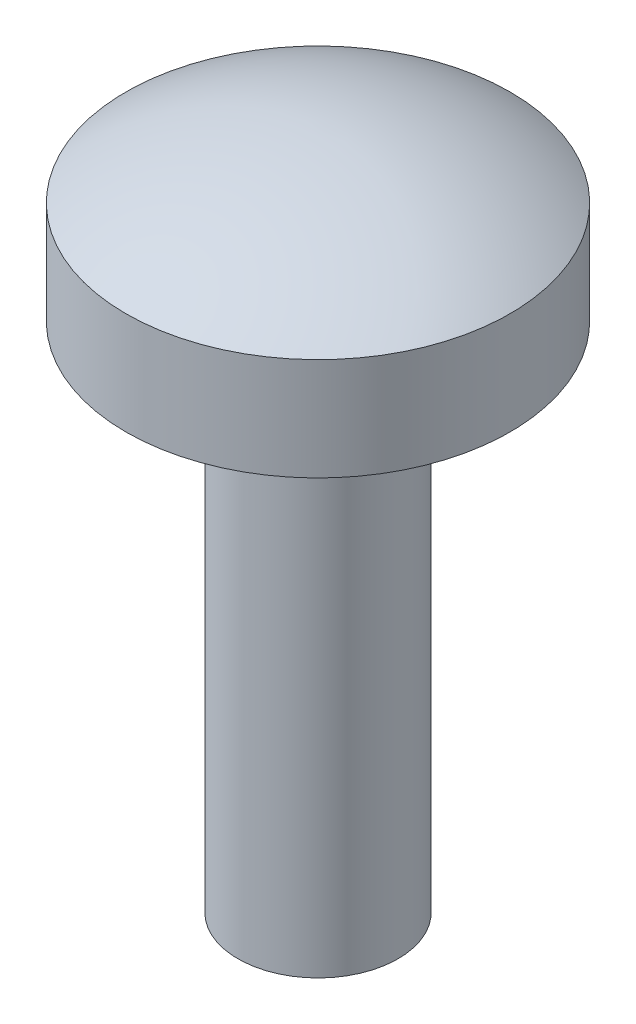
ISO-10303-21;
HEADER;
FILE_DESCRIPTION(('STEP AP214'),'2;1');
FILE_NAME('part.step','',(''),(''),'','','');
FILE_SCHEMA(('AUTOMOTIVE_DESIGN { 1 0 10303 214 1 1 1 1 }'));
ENDSEC;
DATA;
#1=APPLICATION_CONTEXT('core data for automotive mechanical design processes');
#2=APPLICATION_PROTOCOL_DEFINITION('international standard','automotive_design',2000,#1);
#3=PRODUCT_CONTEXT('',#1,'mechanical');
#4=PRODUCT('Part','Part','',(#3));
#5=PRODUCT_RELATED_PRODUCT_CATEGORY('part','',(#4));
#6=PRODUCT_DEFINITION_FORMATION('','',#4);
#7=PRODUCT_DEFINITION_CONTEXT('part definition',#1,'design');
#8=PRODUCT_DEFINITION('design','',#6,#7);
#9=PRODUCT_DEFINITION_SHAPE('','',#8);
#10=(LENGTH_UNIT() NAMED_UNIT(*) SI_UNIT(.MILLI.,.METRE.));
#11=(NAMED_UNIT(*) PLANE_ANGLE_UNIT() SI_UNIT($,.RADIAN.));
#12=(NAMED_UNIT(*) SI_UNIT($,.STERADIAN.) SOLID_ANGLE_UNIT());
#13=UNCERTAINTY_MEASURE_WITH_UNIT(LENGTH_MEASURE(1.E-05),#10,'distance_accuracy_value','');
#14=(GEOMETRIC_REPRESENTATION_CONTEXT(3) GLOBAL_UNCERTAINTY_ASSIGNED_CONTEXT((#13)) GLOBAL_UNIT_ASSIGNED_CONTEXT((#10,
#11,#12)) REPRESENTATION_CONTEXT('',''));
#15=CARTESIAN_POINT('',(0.,0.,0.));
#16=DIRECTION('',(0.,0.,1.));
#17=DIRECTION('',(1.,0.,0.));
#18=AXIS2_PLACEMENT_3D('',#15,#16,#17);
#19=CARTESIAN_POINT('',(0.,0.,0.));
#20=DIRECTION('',(0.,1.,0.));
#21=DIRECTION('',(0.,0.,1.));
#22=AXIS2_PLACEMENT_3D('',#19,#20,#21);
#23=PLANE('',#22);
#24=CARTESIAN_POINT('',(0.,0.,0.));
#25=DIRECTION('',(0.,-1.,0.));
#26=DIRECTION('',(0.,0.,-1.));
#27=AXIS2_PLACEMENT_3D('',#24,#25,#26);
#28=CIRCLE('',#27,1.25);
#29=CARTESIAN_POINT('',(0.,0.,-1.25));
#30=VERTEX_POINT('',#29);
#31=EDGE_CURVE('E10',#30,#30,#28,.T.);
#32=ORIENTED_EDGE('',*,*,#31,.F.);
#33=EDGE_LOOP('',(#32));
#34=FACE_BOUND('',#33,.T.);
#35=CARTESIAN_POINT('',(0.,0.,0.));
#36=DIRECTION('',(0.,1.,0.));
#37=DIRECTION('',(0.,0.,1.));
#38=AXIS2_PLACEMENT_3D('',#35,#36,#37);
#39=CIRCLE('',#38,3.);
#40=CARTESIAN_POINT('',(0.,0.,3.));
#41=VERTEX_POINT('',#40);
#42=EDGE_CURVE('E33',#41,#41,#39,.T.);
#43=ORIENTED_EDGE('',*,*,#42,.F.);
#44=EDGE_LOOP('',(#43));
#45=FACE_BOUND('',#44,.T.);
#46=ADVANCED_FACE('F30',(#34,#45),#23,.F.);
#47=CARTESIAN_POINT('',(0.,2.52,0.));
#48=DIRECTION('',(0.,1.,0.));
#49=DIRECTION('',(0.,0.,1.));
#50=AXIS2_PLACEMENT_3D('',#47,#48,#49);
#51=CYLINDRICAL_SURFACE('',#50,3.);
#52=CARTESIAN_POINT('',(0.,1.6,0.));
#53=DIRECTION('',(0.,1.,0.));
#54=DIRECTION('',(0.,0.,1.));
#55=AXIS2_PLACEMENT_3D('',#52,#53,#54);
#56=CIRCLE('',#55,3.);
#57=CARTESIAN_POINT('',(0.,1.6,3.));
#58=VERTEX_POINT('',#57);
#59=EDGE_CURVE('E41',#58,#58,#56,.T.);
#60=ORIENTED_EDGE('',*,*,#59,.F.);
#61=EDGE_LOOP('',(#60));
#62=FACE_BOUND('',#61,.T.);
#63=ORIENTED_EDGE('',*,*,#42,.T.);
#64=EDGE_LOOP('',(#63));
#65=FACE_BOUND('',#64,.T.);
#66=ADVANCED_FACE('F61',(#62,#65),#51,.T.);
#67=CARTESIAN_POINT('',(0.,-2.83130434782609,0.));
#68=DIRECTION('',(0.,1.,0.));
#69=DIRECTION('',(0.,0.,-1.));
#70=AXIS2_PLACEMENT_3D('',#67,#68,#69);
#71=SPHERICAL_SURFACE('',#70,5.35130434782609);
#72=ORIENTED_EDGE('',*,*,#59,.T.);
#73=EDGE_LOOP('',(#72));
#74=FACE_BOUND('',#73,.T.);
#75=ADVANCED_FACE('F54',(#74),#71,.T.);
#76=CARTESIAN_POINT('',(0.,-8.,0.));
#77=DIRECTION('',(0.,1.,0.));
#78=DIRECTION('',(0.,0.,1.));
#79=AXIS2_PLACEMENT_3D('',#76,#77,#78);
#80=CYLINDRICAL_SURFACE('',#79,1.25);
#81=CARTESIAN_POINT('',(0.,-8.,0.));
#82=DIRECTION('',(0.,-1.,0.));
#83=DIRECTION('',(0.,0.,-1.));
#84=AXIS2_PLACEMENT_3D('',#81,#82,#83);
#85=CIRCLE('',#84,1.25);
#86=CARTESIAN_POINT('',(0.,-8.,-1.25));
#87=VERTEX_POINT('',#86);
#88=EDGE_CURVE('E43',#87,#87,#85,.T.);
#89=ORIENTED_EDGE('',*,*,#88,.F.);
#90=EDGE_LOOP('',(#89));
#91=FACE_BOUND('',#90,.T.);
#92=ORIENTED_EDGE('',*,*,#31,.T.);
#93=EDGE_LOOP('',(#92));
#94=FACE_BOUND('',#93,.T.);
#95=ADVANCED_FACE('F52',(#91,#94),#80,.T.);
#96=CARTESIAN_POINT('',(0.,-8.,0.));
#97=DIRECTION('',(0.,-1.,0.));
#98=DIRECTION('',(0.,0.,-1.));
#99=AXIS2_PLACEMENT_3D('',#96,#97,#98);
#100=PLANE('',#99);
#101=ORIENTED_EDGE('',*,*,#88,.T.);
#102=EDGE_LOOP('',(#101));
#103=FACE_BOUND('',#102,.T.);
#104=ADVANCED_FACE('F50',(#103),#100,.T.);
#105=CLOSED_SHELL('',(#46,#66,#75,#95,#104));
#106=MANIFOLD_SOLID_BREP('B2',#105);
#107=ADVANCED_BREP_SHAPE_REPRESENTATION('',(#18,#106),#14);
#108=SHAPE_DEFINITION_REPRESENTATION(#9,#107);
ENDSEC;
END-ISO-10303-21;
